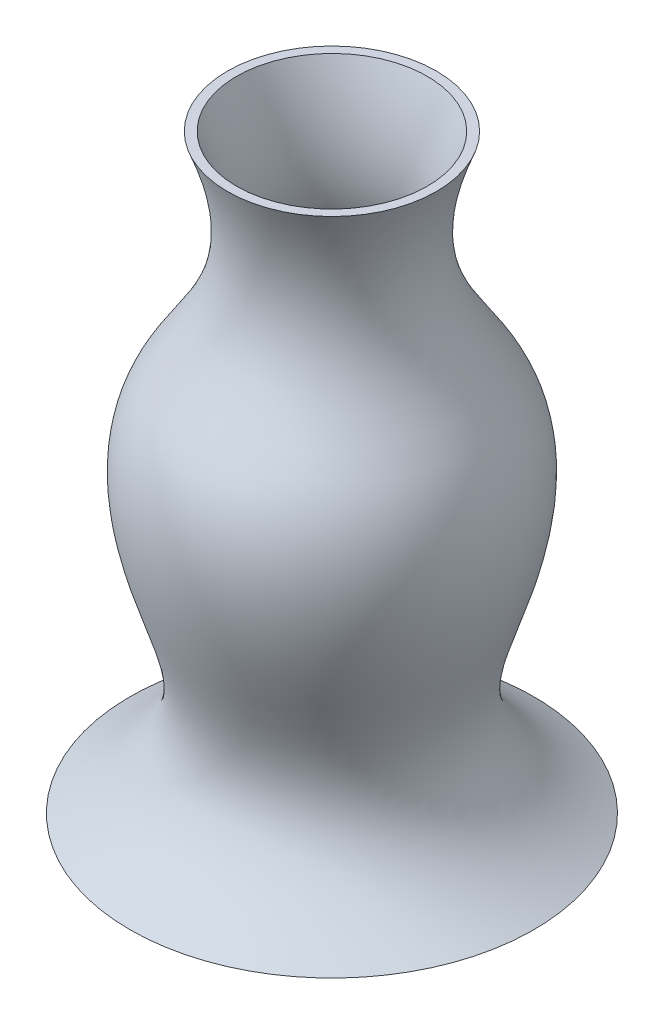
ISO-10303-21;
HEADER;
FILE_DESCRIPTION(('STEP AP214'),'2;1');
FILE_NAME('part.step','',(''),(''),'','','');
FILE_SCHEMA(('AUTOMOTIVE_DESIGN { 1 0 10303 214 1 1 1 1 }'));
ENDSEC;
DATA;
#1=APPLICATION_CONTEXT('core data for automotive mechanical design processes');
#2=APPLICATION_PROTOCOL_DEFINITION('international standard','automotive_design',2000,#1);
#3=PRODUCT_CONTEXT('',#1,'mechanical');
#4=PRODUCT('Part','Part','',(#3));
#5=PRODUCT_RELATED_PRODUCT_CATEGORY('part','',(#4));
#6=PRODUCT_DEFINITION_FORMATION('','',#4);
#7=PRODUCT_DEFINITION_CONTEXT('part definition',#1,'design');
#8=PRODUCT_DEFINITION('design','',#6,#7);
#9=PRODUCT_DEFINITION_SHAPE('','',#8);
#10=(LENGTH_UNIT() NAMED_UNIT(*) SI_UNIT(.MILLI.,.METRE.));
#11=(NAMED_UNIT(*) PLANE_ANGLE_UNIT() SI_UNIT($,.RADIAN.));
#12=(NAMED_UNIT(*) SI_UNIT($,.STERADIAN.) SOLID_ANGLE_UNIT());
#13=UNCERTAINTY_MEASURE_WITH_UNIT(LENGTH_MEASURE(1.E-05),#10,'distance_accuracy_value','');
#14=(GEOMETRIC_REPRESENTATION_CONTEXT(3) GLOBAL_UNCERTAINTY_ASSIGNED_CONTEXT((#13)) GLOBAL_UNIT_ASSIGNED_CONTEXT((#10,
#11,#12)) REPRESENTATION_CONTEXT('',''));
#15=CARTESIAN_POINT('',(0.,0.,0.));
#16=DIRECTION('',(0.,0.,1.));
#17=DIRECTION('',(1.,0.,0.));
#18=AXIS2_PLACEMENT_3D('',#15,#16,#17);
#19=CARTESIAN_POINT('',(18.4972869462001,23.5386693780839,0.));
#20=DIRECTION('',(0.,-1.,0.));
#21=DIRECTION('',(0.,0.,-1.));
#22=AXIS2_PLACEMENT_3D('',#19,#20,#21);
#23=PLANE('',#22);
#24=CARTESIAN_POINT('',(0.,23.5386693780839,0.));
#25=DIRECTION('',(0.,1.,0.));
#26=DIRECTION('',(0.,0.,1.));
#27=AXIS2_PLACEMENT_3D('',#24,#25,#26);
#28=CIRCLE('',#27,16.8846627048673);
#29=CARTESIAN_POINT('',(0.,23.5386693780839,16.8846627048673));
#30=VERTEX_POINT('',#29);
#31=EDGE_CURVE('E45',#30,#30,#28,.T.);
#32=ORIENTED_EDGE('',*,*,#31,.F.);
#33=EDGE_LOOP('',(#32));
#34=FACE_BOUND('',#33,.T.);
#35=CARTESIAN_POINT('',(0.,23.5386693780839,0.));
#36=DIRECTION('',(0.,1.,0.));
#37=DIRECTION('',(0.,0.,1.));
#38=AXIS2_PLACEMENT_3D('',#35,#36,#37);
#39=CIRCLE('',#38,18.4972869462001);
#40=CARTESIAN_POINT('',(0.,23.5386693780839,18.4972869462001));
#41=VERTEX_POINT('',#40);
#42=EDGE_CURVE('E10',#41,#41,#39,.T.);
#43=ORIENTED_EDGE('',*,*,#42,.T.);
#44=EDGE_LOOP('',(#43));
#45=FACE_BOUND('',#44,.T.);
#46=ADVANCED_FACE('F35',(#34,#45),#23,.F.);
#47=CARTESIAN_POINT('',(35.7650170541889,-81.0695020055477,0.));
#48=CARTESIAN_POINT('',(14.9730189939753,-69.7007127837175,0.));
#49=CARTESIAN_POINT('',(26.0712390051291,-48.2339029093352,0.));
#50=CARTESIAN_POINT('',(31.7090857334854,-15.1332765760851,0.));
#51=CARTESIAN_POINT('',(9.71442332718954,1.57820295617025,0.));
#52=CARTESIAN_POINT('',(18.4972869462001,23.5386693780839,0.));
#53=B_SPLINE_CURVE_WITH_KNOTS('',3,(#47,#48,#49,#50,#51,#52),.UNSPECIFIED.,.F.,.F.,(4,1,1,4),
(0.,0.387003286958624,0.707123434613475,1.),.UNSPECIFIED.);
#54=CARTESIAN_POINT('',(0.,23.5386693780839,0.));
#55=DIRECTION('',(0.,1.,0.));
#56=AXIS1_PLACEMENT('',#54,#55);
#57=SURFACE_OF_REVOLUTION('',#53,#56);
#58=ORIENTED_EDGE('',*,*,#42,.F.);
#59=EDGE_LOOP('',(#58));
#60=FACE_BOUND('',#59,.T.);
#61=CARTESIAN_POINT('',(0.,-81.0695020055477,0.));
#62=DIRECTION('',(0.,1.,0.));
#63=DIRECTION('',(0.,0.,1.));
#64=AXIS2_PLACEMENT_3D('',#61,#62,#63);
#65=CIRCLE('',#64,35.7650170541889);
#66=CARTESIAN_POINT('',(0.,-81.0695020055477,35.7650170541889));
#67=VERTEX_POINT('',#66);
#68=EDGE_CURVE('E41',#67,#67,#65,.T.);
#69=ORIENTED_EDGE('',*,*,#68,.T.);
#70=EDGE_LOOP('',(#69));
#71=FACE_BOUND('',#70,.T.);
#72=ADVANCED_FACE('F60',(#60,#71),#57,.T.);
#73=CARTESIAN_POINT('',(35.7650170541888,-81.0695020055477,0.));
#74=DIRECTION('',(0.,1.,0.));
#75=DIRECTION('',(0.,0.,1.));
#76=AXIS2_PLACEMENT_3D('',#73,#74,#75);
#77=PLANE('',#76);
#78=ORIENTED_EDGE('',*,*,#68,.F.);
#79=EDGE_LOOP('',(#78));
#80=FACE_BOUND('',#79,.T.);
#81=ADVANCED_FACE('F65',(#80),#77,.F.);
#82=CARTESIAN_POINT('',(35.7650170541889,-81.0695020055477,0.));
#83=CARTESIAN_POINT('',(14.9730189939753,-69.7007127837175,0.));
#84=CARTESIAN_POINT('',(26.0712390051291,-48.2339029093352,0.));
#85=CARTESIAN_POINT('',(31.7090857334854,-15.1332765760851,0.));
#86=CARTESIAN_POINT('',(9.71442332718954,1.57820295617025,0.));
#87=CARTESIAN_POINT('',(18.4972869462001,23.5386693780839,0.));
#88=B_SPLINE_CURVE_WITH_KNOTS('',3,(#82,#83,#84,#85,#86,#87),.UNSPECIFIED.,.F.,.F.,(4,1,1,4),
(0.,0.387003286958624,0.707123434613475,1.),.UNSPECIFIED.);
#89=CARTESIAN_POINT('',(0.,23.5386693780839,0.));
#90=DIRECTION('',(0.,1.,0.));
#91=AXIS1_PLACEMENT('',#89,#90);
#92=SURFACE_OF_REVOLUTION('',#88,#91);
#93=OFFSET_SURFACE('',#92,-1.5,.F.);
#94=ORIENTED_EDGE('',*,*,#31,.T.);
#95=EDGE_LOOP('',(#94));
#96=FACE_BOUND('',#95,.T.);
#97=CARTESIAN_POINT('',(0.,-79.5695020055476,0.));
#98=DIRECTION('',(0.,1.,0.));
#99=DIRECTION('',(0.,0.,1.));
#100=AXIS2_PLACEMENT_3D('',#97,#98,#99);
#101=CIRCLE('',#100,30.4258920264455);
#102=CARTESIAN_POINT('',(0.,-79.5695020055476,30.4258920264455));
#103=VERTEX_POINT('',#102);
#104=EDGE_CURVE('E49',#103,#103,#101,.T.);
#105=ORIENTED_EDGE('',*,*,#104,.F.);
#106=EDGE_LOOP('',(#105));
#107=FACE_BOUND('',#106,.T.);
#108=ADVANCED_FACE('F67',(#96,#107),#93,.F.);
#109=CARTESIAN_POINT('',(35.7650170541888,-79.5695020055477,0.));
#110=DIRECTION('',(0.,1.,0.));
#111=DIRECTION('',(0.,0.,1.));
#112=AXIS2_PLACEMENT_3D('',#109,#110,#111);
#113=PLANE('',#112);
#114=ORIENTED_EDGE('',*,*,#104,.T.);
#115=EDGE_LOOP('',(#114));
#116=FACE_BOUND('',#115,.T.);
#117=ADVANCED_FACE('F68',(#116),#113,.T.);
#118=CLOSED_SHELL('',(#46,#72,#81,#108,#117));
#119=MANIFOLD_SOLID_BREP('B2',#118);
#120=ADVANCED_BREP_SHAPE_REPRESENTATION('',(#18,#119),#14);
#121=SHAPE_DEFINITION_REPRESENTATION(#9,#120);
ENDSEC;
END-ISO-10303-21;
